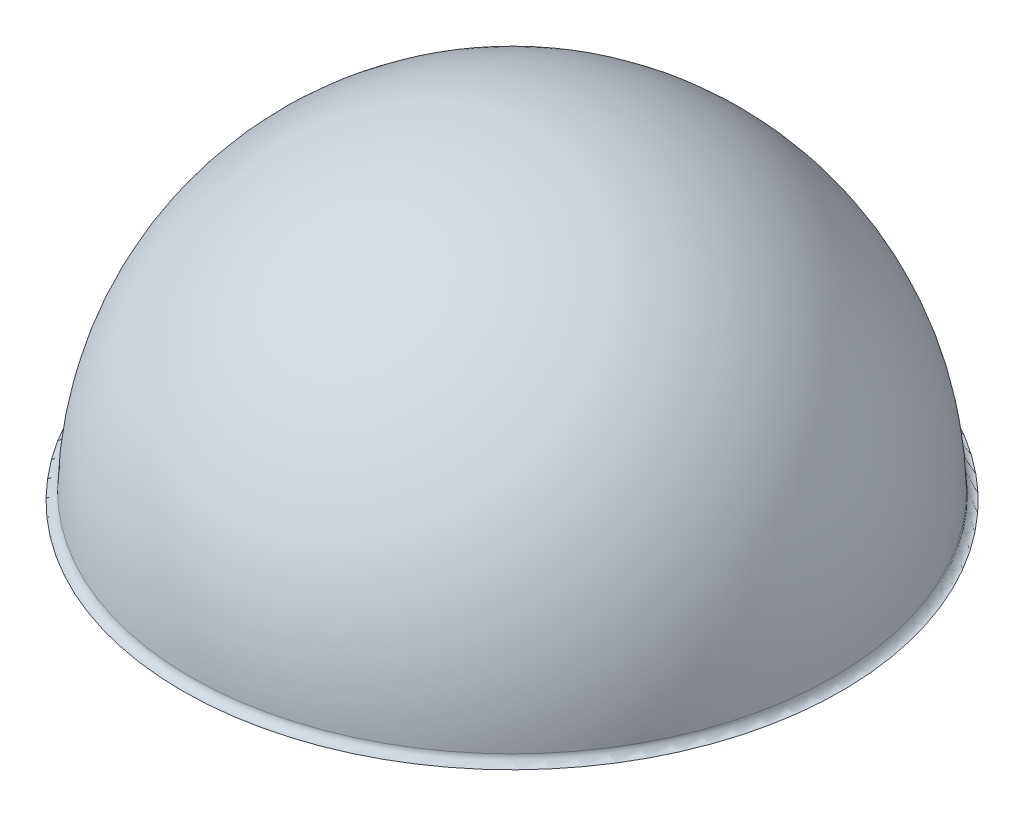
ISO-10303-21;
HEADER;
FILE_DESCRIPTION(('STEP AP214'),'2;1');
FILE_NAME('part.step','',(''),(''),'','','');
FILE_SCHEMA(('AUTOMOTIVE_DESIGN { 1 0 10303 214 1 1 1 1 }'));
ENDSEC;
DATA;
#1=APPLICATION_CONTEXT('core data for automotive mechanical design processes');
#2=APPLICATION_PROTOCOL_DEFINITION('international standard','automotive_design',2000,#1);
#3=PRODUCT_CONTEXT('',#1,'mechanical');
#4=PRODUCT('Part','Part','',(#3));
#5=PRODUCT_RELATED_PRODUCT_CATEGORY('part','',(#4));
#6=PRODUCT_DEFINITION_FORMATION('','',#4);
#7=PRODUCT_DEFINITION_CONTEXT('part definition',#1,'design');
#8=PRODUCT_DEFINITION('design','',#6,#7);
#9=PRODUCT_DEFINITION_SHAPE('','',#8);
#10=(LENGTH_UNIT() NAMED_UNIT(*) SI_UNIT(.MILLI.,.METRE.));
#11=(NAMED_UNIT(*) PLANE_ANGLE_UNIT() SI_UNIT($,.RADIAN.));
#12=(NAMED_UNIT(*) SI_UNIT($,.STERADIAN.) SOLID_ANGLE_UNIT());
#13=UNCERTAINTY_MEASURE_WITH_UNIT(LENGTH_MEASURE(1.E-05),#10,'distance_accuracy_value','');
#14=(GEOMETRIC_REPRESENTATION_CONTEXT(3) GLOBAL_UNCERTAINTY_ASSIGNED_CONTEXT((#13)) GLOBAL_UNIT_ASSIGNED_CONTEXT((#10,
#11,#12)) REPRESENTATION_CONTEXT('',''));
#15=CARTESIAN_POINT('',(0.,0.,0.));
#16=DIRECTION('',(0.,0.,1.));
#17=DIRECTION('',(1.,0.,0.));
#18=AXIS2_PLACEMENT_3D('',#15,#16,#17);
#19=CARTESIAN_POINT('',(1.25,0.,0.));
#20=DIRECTION('',(0.,1.,0.));
#21=DIRECTION('',(0.,0.,1.));
#22=AXIS2_PLACEMENT_3D('',#19,#20,#21);
#23=PLANE('',#22);
#24=CARTESIAN_POINT('',(1.25,0.,0.));
#25=DIRECTION('',(0.,-1.,0.));
#26=DIRECTION('',(0.,0.,-1.));
#27=AXIS2_PLACEMENT_3D('',#24,#25,#26);
#28=CIRCLE('',#27,1.15352782417009);
#29=CARTESIAN_POINT('',(1.25,0.,-1.15352782417009));
#30=VERTEX_POINT('',#29);
#31=EDGE_CURVE('E41',#30,#30,#28,.F.);
#32=ORIENTED_EDGE('',*,*,#31,.T.);
#33=EDGE_LOOP('',(#32));
#34=FACE_BOUND('',#33,.T.);
#35=CARTESIAN_POINT('',(1.25,0.,0.));
#36=DIRECTION('',(0.,1.,0.));
#37=DIRECTION('',(0.,0.,1.));
#38=AXIS2_PLACEMENT_3D('',#35,#36,#37);
#39=CIRCLE('',#38,1.28154911160407);
#40=CARTESIAN_POINT('',(1.25,0.,1.28154911160407));
#41=VERTEX_POINT('',#40);
#42=EDGE_CURVE('E10',#41,#41,#39,.T.);
#43=ORIENTED_EDGE('',*,*,#42,.F.);
#44=EDGE_LOOP('',(#43));
#45=FACE_BOUND('',#44,.T.);
#46=ADVANCED_FACE('F31',(#34,#45),#23,.F.);
#47=CARTESIAN_POINT('',(1.25,0.0319472501812766,0.));
#48=DIRECTION('',(0.,1.,0.));
#49=DIRECTION('',(0.,0.,1.));
#50=AXIS2_PLACEMENT_3D('',#47,#48,#49);
#51=TOROIDAL_SURFACE('',#50,1.28154911160407,0.0319472501812764);
#52=CARTESIAN_POINT('',(1.25,0.0311510966780799,0.));
#53=DIRECTION('',(0.,1.,0.));
#54=DIRECTION('',(0.,0.,1.));
#55=AXIS2_PLACEMENT_3D('',#52,#53,#54);
#56=CIRCLE('',#55,1.24961178338545);
#57=CARTESIAN_POINT('',(1.25,0.0311510966780799,1.24961178338545));
#58=VERTEX_POINT('',#57);
#59=EDGE_CURVE('E37',#58,#58,#56,.T.);
#60=ORIENTED_EDGE('',*,*,#59,.F.);
#61=EDGE_LOOP('',(#60));
#62=FACE_BOUND('',#61,.T.);
#63=ORIENTED_EDGE('',*,*,#42,.T.);
#64=EDGE_LOOP('',(#63));
#65=FACE_BOUND('',#64,.T.);
#66=ADVANCED_FACE('F64',(#62,#65),#51,.F.);
#67=CARTESIAN_POINT('',(1.25,0.,0.));
#68=DIRECTION('',(0.,1.,0.));
#69=DIRECTION('',(1.,0.,0.));
#70=AXIS2_PLACEMENT_3D('',#67,#68,#69);
#71=SPHERICAL_SURFACE('',#70,1.25);
#72=ORIENTED_EDGE('',*,*,#59,.T.);
#73=EDGE_LOOP('',(#72));
#74=FACE_BOUND('',#73,.T.);
#75=ADVANCED_FACE('F60',(#74),#71,.T.);
#76=CARTESIAN_POINT('',(1.25,0.0319472501812766,0.));
#77=DIRECTION('',(0.,1.,0.));
#78=DIRECTION('',(0.,0.,1.));
#79=AXIS2_PLACEMENT_3D('',#76,#77,#78);
#80=TOROIDAL_SURFACE('',#79,1.28154911160407,0.131947250181276);
#81=CARTESIAN_POINT('',(1.25,0.0286590089438335,0.));
#82=DIRECTION('',(0.,1.,0.));
#83=DIRECTION('',(0.,0.,1.));
#84=AXIS2_PLACEMENT_3D('',#81,#82,#83);
#85=CIRCLE('',#84,1.14964284071461);
#86=CARTESIAN_POINT('',(1.25,0.0286590089438335,1.14964284071461));
#87=VERTEX_POINT('',#86);
#88=EDGE_CURVE('E45',#87,#87,#85,.T.);
#89=ORIENTED_EDGE('',*,*,#88,.T.);
#90=EDGE_LOOP('',(#89));
#91=FACE_BOUND('',#90,.T.);
#92=ORIENTED_EDGE('',*,*,#31,.F.);
#93=EDGE_LOOP('',(#92));
#94=FACE_BOUND('',#93,.T.);
#95=ADVANCED_FACE('F51',(#91,#94),#80,.T.);
#96=CARTESIAN_POINT('',(1.25,0.,0.));
#97=DIRECTION('',(0.,1.,0.));
#98=DIRECTION('',(1.,0.,0.));
#99=AXIS2_PLACEMENT_3D('',#96,#97,#98);
#100=SPHERICAL_SURFACE('',#99,1.15);
#101=ORIENTED_EDGE('',*,*,#88,.F.);
#102=EDGE_LOOP('',(#101));
#103=FACE_BOUND('',#102,.T.);
#104=ADVANCED_FACE('F54',(#103),#100,.F.);
#105=CLOSED_SHELL('',(#46,#66,#75,#95,#104));
#106=MANIFOLD_SOLID_BREP('B2',#105);
#107=ADVANCED_BREP_SHAPE_REPRESENTATION('',(#18,#106),#14);
#108=SHAPE_DEFINITION_REPRESENTATION(#9,#107);
ENDSEC;
END-ISO-10303-21;
